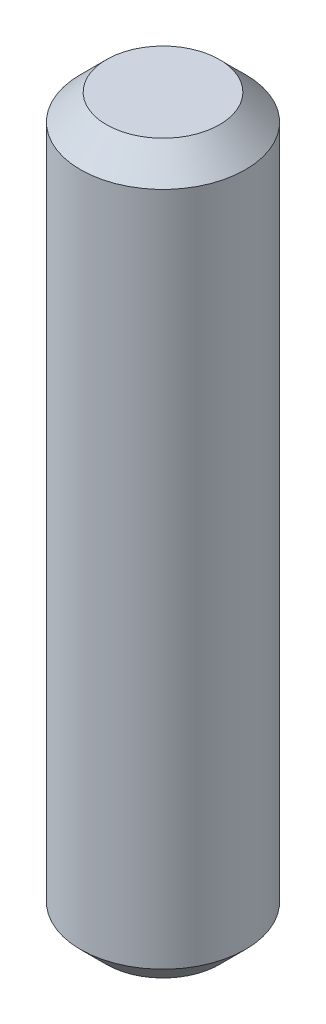
ISO-10303-21;
HEADER;
FILE_DESCRIPTION(('STEP AP214'),'2;1');
FILE_NAME('part.step','',(''),(''),'','','');
FILE_SCHEMA(('AUTOMOTIVE_DESIGN { 1 0 10303 214 1 1 1 1 }'));
ENDSEC;
DATA;
#1=APPLICATION_CONTEXT('core data for automotive mechanical design processes');
#2=APPLICATION_PROTOCOL_DEFINITION('international standard','automotive_design',2000,#1);
#3=PRODUCT_CONTEXT('',#1,'mechanical');
#4=PRODUCT('Part','Part','',(#3));
#5=PRODUCT_RELATED_PRODUCT_CATEGORY('part','',(#4));
#6=PRODUCT_DEFINITION_FORMATION('','',#4);
#7=PRODUCT_DEFINITION_CONTEXT('part definition',#1,'design');
#8=PRODUCT_DEFINITION('design','',#6,#7);
#9=PRODUCT_DEFINITION_SHAPE('','',#8);
#10=(LENGTH_UNIT() NAMED_UNIT(*) SI_UNIT(.MILLI.,.METRE.));
#11=(NAMED_UNIT(*) PLANE_ANGLE_UNIT() SI_UNIT($,.RADIAN.));
#12=(NAMED_UNIT(*) SI_UNIT($,.STERADIAN.) SOLID_ANGLE_UNIT());
#13=UNCERTAINTY_MEASURE_WITH_UNIT(LENGTH_MEASURE(1.E-05),#10,'distance_accuracy_value','');
#14=(GEOMETRIC_REPRESENTATION_CONTEXT(3) GLOBAL_UNCERTAINTY_ASSIGNED_CONTEXT((#13)) GLOBAL_UNIT_ASSIGNED_CONTEXT((#10,
#11,#12)) REPRESENTATION_CONTEXT('',''));
#15=CARTESIAN_POINT('',(0.,0.,0.));
#16=DIRECTION('',(0.,0.,1.));
#17=DIRECTION('',(1.,0.,0.));
#18=AXIS2_PLACEMENT_3D('',#15,#16,#17);
#19=CARTESIAN_POINT('',(0.,14.,0.));
#20=DIRECTION('',(0.,-1.,0.));
#21=DIRECTION('',(0.,0.,-1.));
#22=AXIS2_PLACEMENT_3D('',#19,#20,#21);
#23=CYLINDRICAL_SURFACE('',#22,1.5875);
#24=CARTESIAN_POINT('',(0.,0.500000000000002,0.));
#25=DIRECTION('',(0.,1.,0.));
#26=DIRECTION('',(0.,0.,1.));
#27=AXIS2_PLACEMENT_3D('',#24,#25,#26);
#28=CIRCLE('',#27,1.5875);
#29=CARTESIAN_POINT('',(0.,0.500000000000002,1.5875));
#30=VERTEX_POINT('',#29);
#31=EDGE_CURVE('E48',#30,#30,#28,.T.);
#32=ORIENTED_EDGE('',*,*,#31,.T.);
#33=EDGE_LOOP('',(#32));
#34=FACE_BOUND('',#33,.T.);
#35=CARTESIAN_POINT('',(0.,13.5,0.));
#36=DIRECTION('',(0.,1.,0.));
#37=DIRECTION('',(0.,0.,1.));
#38=AXIS2_PLACEMENT_3D('',#35,#36,#37);
#39=CIRCLE('',#38,1.5875);
#40=CARTESIAN_POINT('',(0.,13.5,1.5875));
#41=VERTEX_POINT('',#40);
#42=EDGE_CURVE('E52',#41,#41,#39,.F.);
#43=ORIENTED_EDGE('',*,*,#42,.T.);
#44=EDGE_LOOP('',(#43));
#45=FACE_BOUND('',#44,.T.);
#46=ADVANCED_FACE('F36',(#34,#45),#23,.T.);
#47=CARTESIAN_POINT('',(0.,14.,0.));
#48=DIRECTION('',(0.,1.,0.));
#49=DIRECTION('',(0.,0.,1.));
#50=AXIS2_PLACEMENT_3D('',#47,#48,#49);
#51=PLANE('',#50);
#52=CARTESIAN_POINT('',(0.,14.,0.));
#53=DIRECTION('',(0.,1.,0.));
#54=DIRECTION('',(0.,0.,1.));
#55=AXIS2_PLACEMENT_3D('',#52,#53,#54);
#56=CIRCLE('',#55,1.0875);
#57=CARTESIAN_POINT('',(0.,14.,1.0875));
#58=VERTEX_POINT('',#57);
#59=EDGE_CURVE('E10',#58,#58,#56,.T.);
#60=ORIENTED_EDGE('',*,*,#59,.T.);
#61=EDGE_LOOP('',(#60));
#62=FACE_BOUND('',#61,.T.);
#63=ADVANCED_FACE('F68',(#62),#51,.T.);
#64=CARTESIAN_POINT('',(0.,0.,0.));
#65=DIRECTION('',(0.,1.,0.));
#66=DIRECTION('',(0.,0.,1.));
#67=AXIS2_PLACEMENT_3D('',#64,#65,#66);
#68=PLANE('',#67);
#69=CARTESIAN_POINT('',(0.,0.,0.));
#70=DIRECTION('',(0.,1.,0.));
#71=DIRECTION('',(0.,0.,1.));
#72=AXIS2_PLACEMENT_3D('',#69,#70,#71);
#73=CIRCLE('',#72,1.0875);
#74=CARTESIAN_POINT('',(0.,0.,1.0875));
#75=VERTEX_POINT('',#74);
#76=EDGE_CURVE('E44',#75,#75,#73,.F.);
#77=ORIENTED_EDGE('',*,*,#76,.T.);
#78=EDGE_LOOP('',(#77));
#79=FACE_BOUND('',#78,.T.);
#80=ADVANCED_FACE('F65',(#79),#68,.F.);
#81=CARTESIAN_POINT('',(0.,0.500000000000002,0.));
#82=DIRECTION('',(0.,1.,0.));
#83=DIRECTION('',(0.,0.,1.));
#84=AXIS2_PLACEMENT_3D('',#81,#82,#83);
#85=CONICAL_SURFACE('',#84,1.5875,0.785398163397449);
#86=ORIENTED_EDGE('',*,*,#76,.F.);
#87=EDGE_LOOP('',(#86));
#88=FACE_BOUND('',#87,.T.);
#89=ORIENTED_EDGE('',*,*,#31,.F.);
#90=EDGE_LOOP('',(#89));
#91=FACE_BOUND('',#90,.T.);
#92=ADVANCED_FACE('F61',(#88,#91),#85,.T.);
#93=CARTESIAN_POINT('',(0.,14.,0.));
#94=DIRECTION('',(0.,-1.,0.));
#95=DIRECTION('',(0.,0.,-1.));
#96=AXIS2_PLACEMENT_3D('',#93,#94,#95);
#97=CONICAL_SURFACE('',#96,1.0875,0.785398163397446);
#98=ORIENTED_EDGE('',*,*,#42,.F.);
#99=EDGE_LOOP('',(#98));
#100=FACE_BOUND('',#99,.T.);
#101=ORIENTED_EDGE('',*,*,#59,.F.);
#102=EDGE_LOOP('',(#101));
#103=FACE_BOUND('',#102,.T.);
#104=ADVANCED_FACE('F39',(#100,#103),#97,.T.);
#105=CLOSED_SHELL('',(#46,#63,#80,#92,#104));
#106=MANIFOLD_SOLID_BREP('B2',#105);
#107=ADVANCED_BREP_SHAPE_REPRESENTATION('',(#18,#106),#14);
#108=SHAPE_DEFINITION_REPRESENTATION(#9,#107);
ENDSEC;
END-ISO-10303-21;
